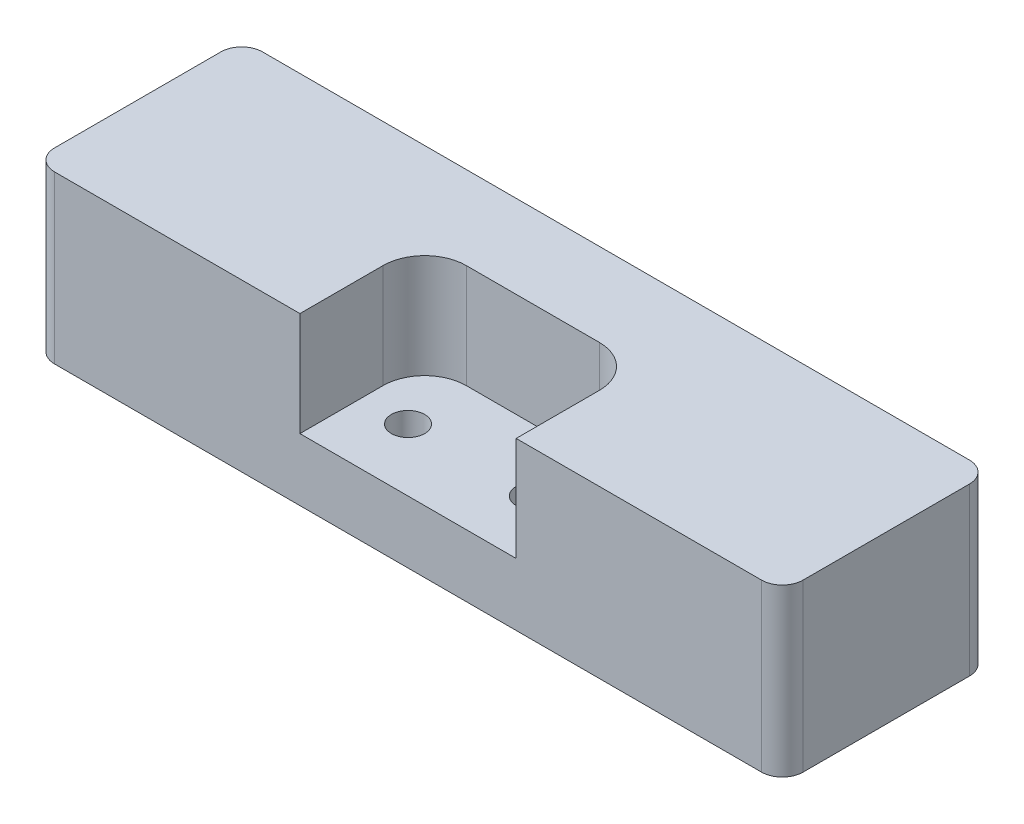
ISO-10303-21;
HEADER;
FILE_DESCRIPTION(('STEP AP214'),'2;1');
FILE_NAME('part.step','',(''),(''),'','','');
FILE_SCHEMA(('AUTOMOTIVE_DESIGN { 1 0 10303 214 1 1 1 1 }'));
ENDSEC;
DATA;
#1=APPLICATION_CONTEXT('core data for automotive mechanical design processes');
#2=APPLICATION_PROTOCOL_DEFINITION('international standard','automotive_design',2000,#1);
#3=PRODUCT_CONTEXT('',#1,'mechanical');
#4=PRODUCT('Part','Part','',(#3));
#5=PRODUCT_RELATED_PRODUCT_CATEGORY('part','',(#4));
#6=PRODUCT_DEFINITION_FORMATION('','',#4);
#7=PRODUCT_DEFINITION_CONTEXT('part definition',#1,'design');
#8=PRODUCT_DEFINITION('design','',#6,#7);
#9=PRODUCT_DEFINITION_SHAPE('','',#8);
#10=(LENGTH_UNIT() NAMED_UNIT(*) SI_UNIT(.MILLI.,.METRE.));
#11=(NAMED_UNIT(*) PLANE_ANGLE_UNIT() SI_UNIT($,.RADIAN.));
#12=(NAMED_UNIT(*) SI_UNIT($,.STERADIAN.) SOLID_ANGLE_UNIT());
#13=UNCERTAINTY_MEASURE_WITH_UNIT(LENGTH_MEASURE(1.E-05),#10,'distance_accuracy_value','');
#14=(GEOMETRIC_REPRESENTATION_CONTEXT(3) GLOBAL_UNCERTAINTY_ASSIGNED_CONTEXT((#13)) GLOBAL_UNIT_ASSIGNED_CONTEXT((#10,
#11,#12)) REPRESENTATION_CONTEXT('',''));
#15=CARTESIAN_POINT('',(0.,0.,0.));
#16=DIRECTION('',(0.,0.,1.));
#17=DIRECTION('',(1.,0.,0.));
#18=AXIS2_PLACEMENT_3D('',#15,#16,#17);
#19=CARTESIAN_POINT('',(33.,8.,0.));
#20=DIRECTION('',(-1.,0.,0.));
#21=DIRECTION('',(0.,0.,1.));
#22=AXIS2_PLACEMENT_3D('',#19,#20,#21);
#23=PLANE('',#22);
#24=DIRECTION('',(0.,0.,-1.));
#25=VECTOR('',#24,1.);
#26=CARTESIAN_POINT('',(33.,8.,0.));
#27=LINE('',#26,#25);
#28=CARTESIAN_POINT('',(33.,8.,-0.999999999999998));
#29=VERTEX_POINT('',#28);
#30=CARTESIAN_POINT('',(33.,8.,-9.));
#31=VERTEX_POINT('',#30);
#32=EDGE_CURVE('E172',#29,#31,#27,.T.);
#33=ORIENTED_EDGE('',*,*,#32,.F.);
#34=DIRECTION('',(0.,-1.,0.));
#35=VECTOR('',#34,1.);
#36=CARTESIAN_POINT('',(33.,8.,-0.999999999999998));
#37=LINE('',#36,#35);
#38=CARTESIAN_POINT('',(33.,0.,-0.999999999999998));
#39=VERTEX_POINT('',#38);
#40=EDGE_CURVE('E197',#29,#39,#37,.T.);
#41=ORIENTED_EDGE('',*,*,#40,.T.);
#42=DIRECTION('',(0.,0.,-1.));
#43=VECTOR('',#42,1.);
#44=CARTESIAN_POINT('',(33.,0.,0.));
#45=LINE('',#44,#43);
#46=CARTESIAN_POINT('',(33.,0.,-9.));
#47=VERTEX_POINT('',#46);
#48=EDGE_CURVE('E170',#39,#47,#45,.T.);
#49=ORIENTED_EDGE('',*,*,#48,.T.);
#50=DIRECTION('',(0.,-1.,0.));
#51=VECTOR('',#50,1.);
#52=CARTESIAN_POINT('',(33.,8.,-9.));
#53=LINE('',#52,#51);
#54=EDGE_CURVE('E185',#47,#31,#53,.F.);
#55=ORIENTED_EDGE('',*,*,#54,.T.);
#56=EDGE_LOOP('',(#33,#41,#49,#55));
#57=FACE_BOUND('',#56,.T.);
#58=ADVANCED_FACE('F37',(#57),#23,.F.);
#59=CARTESIAN_POINT('',(-3.,8.,-10.));
#60=DIRECTION('',(0.,0.,1.));
#61=DIRECTION('',(1.,0.,0.));
#62=AXIS2_PLACEMENT_3D('',#59,#60,#61);
#63=PLANE('',#62);
#64=DIRECTION('',(-1.,0.,0.));
#65=VECTOR('',#64,1.);
#66=CARTESIAN_POINT('',(-3.,8.,-10.));
#67=LINE('',#66,#65);
#68=CARTESIAN_POINT('',(32.,8.,-10.));
#69=VERTEX_POINT('',#68);
#70=CARTESIAN_POINT('',(-2.,8.,-10.));
#71=VERTEX_POINT('',#70);
#72=EDGE_CURVE('E175',#69,#71,#67,.T.);
#73=ORIENTED_EDGE('',*,*,#72,.F.);
#74=DIRECTION('',(0.,-1.,0.));
#75=VECTOR('',#74,1.);
#76=CARTESIAN_POINT('',(32.,8.,-10.));
#77=LINE('',#76,#75);
#78=CARTESIAN_POINT('',(32.,0.,-10.));
#79=VERTEX_POINT('',#78);
#80=EDGE_CURVE('E224',#69,#79,#77,.T.);
#81=ORIENTED_EDGE('',*,*,#80,.T.);
#82=DIRECTION('',(-1.,0.,0.));
#83=VECTOR('',#82,1.);
#84=CARTESIAN_POINT('',(-3.,0.,-10.));
#85=LINE('',#84,#83);
#86=CARTESIAN_POINT('',(-2.,0.,-10.));
#87=VERTEX_POINT('',#86);
#88=EDGE_CURVE('E188',#79,#87,#85,.T.);
#89=ORIENTED_EDGE('',*,*,#88,.T.);
#90=DIRECTION('',(0.,-1.,0.));
#91=VECTOR('',#90,1.);
#92=CARTESIAN_POINT('',(-2.,8.,-10.));
#93=LINE('',#92,#91);
#94=EDGE_CURVE('E222',#87,#71,#93,.F.);
#95=ORIENTED_EDGE('',*,*,#94,.T.);
#96=EDGE_LOOP('',(#73,#81,#89,#95));
#97=FACE_BOUND('',#96,.T.);
#98=ADVANCED_FACE('F290',(#97),#63,.F.);
#99=CARTESIAN_POINT('',(-3.,8.,0.));
#100=DIRECTION('',(1.,0.,0.));
#101=DIRECTION('',(0.,0.,-1.));
#102=AXIS2_PLACEMENT_3D('',#99,#100,#101);
#103=PLANE('',#102);
#104=DIRECTION('',(0.,0.,1.));
#105=VECTOR('',#104,1.);
#106=CARTESIAN_POINT('',(-3.,8.,0.));
#107=LINE('',#106,#105);
#108=CARTESIAN_POINT('',(-3.,8.,-9.));
#109=VERTEX_POINT('',#108);
#110=CARTESIAN_POINT('',(-3.,8.,-0.999999999999997));
#111=VERTEX_POINT('',#110);
#112=EDGE_CURVE('E179',#109,#111,#107,.T.);
#113=ORIENTED_EDGE('',*,*,#112,.F.);
#114=DIRECTION('',(0.,-1.,0.));
#115=VECTOR('',#114,1.);
#116=CARTESIAN_POINT('',(-3.,8.,-9.));
#117=LINE('',#116,#115);
#118=CARTESIAN_POINT('',(-3.,0.,-9.));
#119=VERTEX_POINT('',#118);
#120=EDGE_CURVE('E229',#109,#119,#117,.T.);
#121=ORIENTED_EDGE('',*,*,#120,.T.);
#122=DIRECTION('',(0.,0.,1.));
#123=VECTOR('',#122,1.);
#124=CARTESIAN_POINT('',(-3.,0.,0.));
#125=LINE('',#124,#123);
#126=CARTESIAN_POINT('',(-3.,0.,-0.999999999999997));
#127=VERTEX_POINT('',#126);
#128=EDGE_CURVE('E191',#119,#127,#125,.T.);
#129=ORIENTED_EDGE('',*,*,#128,.T.);
#130=DIRECTION('',(0.,-1.,0.));
#131=VECTOR('',#130,1.);
#132=CARTESIAN_POINT('',(-3.,8.,-0.999999999999997));
#133=LINE('',#132,#131);
#134=EDGE_CURVE('E227',#127,#111,#133,.F.);
#135=ORIENTED_EDGE('',*,*,#134,.T.);
#136=EDGE_LOOP('',(#113,#121,#129,#135));
#137=FACE_BOUND('',#136,.T.);
#138=ADVANCED_FACE('F296',(#137),#103,.F.);
#139=CARTESIAN_POINT('',(33.,8.,0.));
#140=DIRECTION('',(0.,0.,-1.));
#141=DIRECTION('',(-1.,0.,0.));
#142=AXIS2_PLACEMENT_3D('',#139,#140,#141);
#143=PLANE('',#142);
#144=DIRECTION('',(1.,0.,0.));
#145=VECTOR('',#144,1.);
#146=CARTESIAN_POINT('',(33.,8.,0.));
#147=LINE('',#146,#145);
#148=CARTESIAN_POINT('',(20.2,8.,0.));
#149=VERTEX_POINT('',#148);
#150=CARTESIAN_POINT('',(32.,8.,0.));
#151=VERTEX_POINT('',#150);
#152=EDGE_CURVE('E182',#149,#151,#147,.T.);
#153=ORIENTED_EDGE('',*,*,#152,.F.);
#154=DIRECTION('',(0.,1.,0.));
#155=VECTOR('',#154,1.);
#156=CARTESIAN_POINT('',(20.2,3.,0.));
#157=LINE('',#156,#155);
#158=CARTESIAN_POINT('',(20.2,3.,0.));
#159=VERTEX_POINT('',#158);
#160=EDGE_CURVE('E154',#159,#149,#157,.T.);
#161=ORIENTED_EDGE('',*,*,#160,.F.);
#162=DIRECTION('',(1.,0.,0.));
#163=VECTOR('',#162,1.);
#164=CARTESIAN_POINT('',(9.8,3.,0.));
#165=LINE('',#164,#163);
#166=CARTESIAN_POINT('',(9.8,3.,0.));
#167=VERTEX_POINT('',#166);
#168=EDGE_CURVE('E141',#167,#159,#165,.T.);
#169=ORIENTED_EDGE('',*,*,#168,.F.);
#170=DIRECTION('',(0.,1.,0.));
#171=VECTOR('',#170,1.);
#172=CARTESIAN_POINT('',(9.8,3.,0.));
#173=LINE('',#172,#171);
#174=CARTESIAN_POINT('',(9.8,8.,0.));
#175=VERTEX_POINT('',#174);
#176=EDGE_CURVE('E147',#167,#175,#173,.T.);
#177=ORIENTED_EDGE('',*,*,#176,.T.);
#178=CARTESIAN_POINT('',(-1.99999999999999,8.,0.));
#179=VERTEX_POINT('',#178);
#180=EDGE_CURVE('E183',#179,#175,#147,.T.);
#181=ORIENTED_EDGE('',*,*,#180,.F.);
#182=DIRECTION('',(0.,-1.,0.));
#183=VECTOR('',#182,1.);
#184=CARTESIAN_POINT('',(-1.99999999999999,8.,0.));
#185=LINE('',#184,#183);
#186=CARTESIAN_POINT('',(-1.99999999999999,0.,0.));
#187=VERTEX_POINT('',#186);
#188=EDGE_CURVE('E208',#179,#187,#185,.T.);
#189=ORIENTED_EDGE('',*,*,#188,.T.);
#190=DIRECTION('',(1.,0.,0.));
#191=VECTOR('',#190,1.);
#192=CARTESIAN_POINT('',(33.,0.,0.));
#193=LINE('',#192,#191);
#194=CARTESIAN_POINT('',(32.,0.,0.));
#195=VERTEX_POINT('',#194);
#196=EDGE_CURVE('E176',#187,#195,#193,.T.);
#197=ORIENTED_EDGE('',*,*,#196,.T.);
#198=DIRECTION('',(0.,-1.,0.));
#199=VECTOR('',#198,1.);
#200=CARTESIAN_POINT('',(32.,8.,0.));
#201=LINE('',#200,#199);
#202=EDGE_CURVE('E211',#195,#151,#201,.F.);
#203=ORIENTED_EDGE('',*,*,#202,.T.);
#204=EDGE_LOOP('',(#153,#161,#169,#177,#181,#189,#197,#203));
#205=FACE_BOUND('',#204,.T.);
#206=ADVANCED_FACE('F157',(#205),#143,.F.);
#207=CARTESIAN_POINT('',(0.,8.,0.));
#208=DIRECTION('',(0.,-1.,0.));
#209=DIRECTION('',(0.,0.,-1.));
#210=AXIS2_PLACEMENT_3D('',#207,#208,#209);
#211=PLANE('',#210);
#212=DIRECTION('',(-1.,0.,0.));
#213=VECTOR('',#212,1.);
#214=CARTESIAN_POINT('',(9.8,8.,-6.));
#215=LINE('',#214,#213);
#216=CARTESIAN_POINT('',(18.2,8.,-6.));
#217=VERTEX_POINT('',#216);
#218=CARTESIAN_POINT('',(11.8,8.,-6.));
#219=VERTEX_POINT('',#218);
#220=EDGE_CURVE('E164',#217,#219,#215,.T.);
#221=ORIENTED_EDGE('',*,*,#220,.F.);
#222=CARTESIAN_POINT('',(18.2,8.,-4.));
#223=DIRECTION('',(0.,-1.,0.));
#224=DIRECTION('',(0.,0.,-1.));
#225=AXIS2_PLACEMENT_3D('',#222,#223,#224);
#226=CIRCLE('',#225,2.);
#227=CARTESIAN_POINT('',(20.2,8.,-4.));
#228=VERTEX_POINT('',#227);
#229=EDGE_CURVE('E45',#217,#228,#226,.T.);
#230=ORIENTED_EDGE('',*,*,#229,.T.);
#231=DIRECTION('',(0.,0.,-1.));
#232=VECTOR('',#231,1.);
#233=CARTESIAN_POINT('',(20.2,8.,0.));
#234=LINE('',#233,#232);
#235=EDGE_CURVE('E161',#149,#228,#234,.T.);
#236=ORIENTED_EDGE('',*,*,#235,.F.);
#237=ORIENTED_EDGE('',*,*,#152,.T.);
#238=CARTESIAN_POINT('',(32.,8.,-0.999999999999998));
#239=DIRECTION('',(0.,-1.,0.));
#240=DIRECTION('',(0.,0.,-1.));
#241=AXIS2_PLACEMENT_3D('',#238,#239,#240);
#242=CIRCLE('',#241,1.);
#243=EDGE_CURVE('E220',#151,#29,#242,.F.);
#244=ORIENTED_EDGE('',*,*,#243,.T.);
#245=ORIENTED_EDGE('',*,*,#32,.T.);
#246=CARTESIAN_POINT('',(32.,8.,-9.));
#247=DIRECTION('',(0.,-1.,0.));
#248=DIRECTION('',(0.,0.,-1.));
#249=AXIS2_PLACEMENT_3D('',#246,#247,#248);
#250=CIRCLE('',#249,1.);
#251=EDGE_CURVE('E218',#31,#69,#250,.F.);
#252=ORIENTED_EDGE('',*,*,#251,.T.);
#253=ORIENTED_EDGE('',*,*,#72,.T.);
#254=CARTESIAN_POINT('',(-2.,8.,-9.));
#255=DIRECTION('',(0.,-1.,0.));
#256=DIRECTION('',(0.,0.,-1.));
#257=AXIS2_PLACEMENT_3D('',#254,#255,#256);
#258=CIRCLE('',#257,1.);
#259=EDGE_CURVE('E216',#71,#109,#258,.F.);
#260=ORIENTED_EDGE('',*,*,#259,.T.);
#261=ORIENTED_EDGE('',*,*,#112,.T.);
#262=CARTESIAN_POINT('',(-1.99999999999999,8.,-0.999999999999998));
#263=DIRECTION('',(0.,-1.,0.));
#264=DIRECTION('',(0.,0.,-1.));
#265=AXIS2_PLACEMENT_3D('',#262,#263,#264);
#266=CIRCLE('',#265,1.);
#267=EDGE_CURVE('E214',#111,#179,#266,.F.);
#268=ORIENTED_EDGE('',*,*,#267,.T.);
#269=ORIENTED_EDGE('',*,*,#180,.T.);
#270=DIRECTION('',(0.,0.,1.));
#271=VECTOR('',#270,1.);
#272=CARTESIAN_POINT('',(9.8,8.,-6.));
#273=LINE('',#272,#271);
#274=CARTESIAN_POINT('',(9.8,8.,-4.));
#275=VERTEX_POINT('',#274);
#276=EDGE_CURVE('E150',#275,#175,#273,.T.);
#277=ORIENTED_EDGE('',*,*,#276,.F.);
#278=CARTESIAN_POINT('',(11.8,8.,-4.));
#279=DIRECTION('',(0.,-1.,0.));
#280=DIRECTION('',(0.,0.,-1.));
#281=AXIS2_PLACEMENT_3D('',#278,#279,#280);
#282=CIRCLE('',#281,2.);
#283=EDGE_CURVE('E11',#275,#219,#282,.T.);
#284=ORIENTED_EDGE('',*,*,#283,.T.);
#285=EDGE_LOOP('',(#221,#230,#236,#237,#244,#245,#252,#253,#260,#261,#268,#269,#277,#284));
#286=FACE_BOUND('',#285,.T.);
#287=ADVANCED_FACE('F246',(#286),#211,.F.);
#288=CARTESIAN_POINT('',(0.,0.,0.));
#289=DIRECTION('',(0.,-1.,0.));
#290=DIRECTION('',(0.,0.,-1.));
#291=AXIS2_PLACEMENT_3D('',#288,#289,#290);
#292=PLANE('',#291);
#293=CARTESIAN_POINT('',(12.,0.,-3.));
#294=DIRECTION('',(0.,1.,0.));
#295=DIRECTION('',(0.,0.,1.));
#296=AXIS2_PLACEMENT_3D('',#293,#294,#295);
#297=CIRCLE('',#296,0.799999999999999);
#298=CARTESIAN_POINT('',(12.,0.,-2.2));
#299=VERTEX_POINT('',#298);
#300=EDGE_CURVE('E264',#299,#299,#297,.T.);
#301=ORIENTED_EDGE('',*,*,#300,.T.);
#302=EDGE_LOOP('',(#301));
#303=FACE_BOUND('',#302,.T.);
#304=CARTESIAN_POINT('',(18.,0.,-3.));
#305=DIRECTION('',(0.,1.,0.));
#306=DIRECTION('',(0.,0.,1.));
#307=AXIS2_PLACEMENT_3D('',#304,#305,#306);
#308=CIRCLE('',#307,0.799999999999999);
#309=CARTESIAN_POINT('',(18.,0.,-2.2));
#310=VERTEX_POINT('',#309);
#311=EDGE_CURVE('E165',#310,#310,#308,.T.);
#312=ORIENTED_EDGE('',*,*,#311,.T.);
#313=EDGE_LOOP('',(#312));
#314=FACE_BOUND('',#313,.T.);
#315=ORIENTED_EDGE('',*,*,#48,.F.);
#316=CARTESIAN_POINT('',(32.,0.,-0.999999999999998));
#317=DIRECTION('',(0.,-1.,0.));
#318=DIRECTION('',(0.,0.,-1.));
#319=AXIS2_PLACEMENT_3D('',#316,#317,#318);
#320=CIRCLE('',#319,1.);
#321=EDGE_CURVE('E206',#39,#195,#320,.T.);
#322=ORIENTED_EDGE('',*,*,#321,.T.);
#323=ORIENTED_EDGE('',*,*,#196,.F.);
#324=CARTESIAN_POINT('',(-1.99999999999999,0.,-0.999999999999998));
#325=DIRECTION('',(0.,-1.,0.));
#326=DIRECTION('',(0.,0.,-1.));
#327=AXIS2_PLACEMENT_3D('',#324,#325,#326);
#328=CIRCLE('',#327,1.);
#329=EDGE_CURVE('E200',#187,#127,#328,.T.);
#330=ORIENTED_EDGE('',*,*,#329,.T.);
#331=ORIENTED_EDGE('',*,*,#128,.F.);
#332=CARTESIAN_POINT('',(-2.,0.,-9.));
#333=DIRECTION('',(0.,-1.,0.));
#334=DIRECTION('',(0.,0.,-1.));
#335=AXIS2_PLACEMENT_3D('',#332,#333,#334);
#336=CIRCLE('',#335,1.);
#337=EDGE_CURVE('E202',#119,#87,#336,.T.);
#338=ORIENTED_EDGE('',*,*,#337,.T.);
#339=ORIENTED_EDGE('',*,*,#88,.F.);
#340=CARTESIAN_POINT('',(32.,0.,-9.));
#341=DIRECTION('',(0.,-1.,0.));
#342=DIRECTION('',(0.,0.,-1.));
#343=AXIS2_PLACEMENT_3D('',#340,#341,#342);
#344=CIRCLE('',#343,1.);
#345=EDGE_CURVE('E204',#79,#47,#344,.T.);
#346=ORIENTED_EDGE('',*,*,#345,.T.);
#347=EDGE_LOOP('',(#315,#322,#323,#330,#331,#338,#339,#346));
#348=FACE_BOUND('',#347,.T.);
#349=ADVANCED_FACE('F306',(#303,#314,#348),#292,.T.);
#350=CARTESIAN_POINT('',(32.,8.,-0.999999999999998));
#351=DIRECTION('',(0.,-1.,0.));
#352=DIRECTION('',(0.,0.,-1.));
#353=AXIS2_PLACEMENT_3D('',#350,#351,#352);
#354=CYLINDRICAL_SURFACE('',#353,1.);
#355=ORIENTED_EDGE('',*,*,#243,.F.);
#356=ORIENTED_EDGE('',*,*,#202,.F.);
#357=ORIENTED_EDGE('',*,*,#321,.F.);
#358=ORIENTED_EDGE('',*,*,#40,.F.);
#359=EDGE_LOOP('',(#355,#356,#357,#358));
#360=FACE_BOUND('',#359,.T.);
#361=ADVANCED_FACE('F302',(#360),#354,.T.);
#362=CARTESIAN_POINT('',(32.,8.,-9.));
#363=DIRECTION('',(0.,-1.,0.));
#364=DIRECTION('',(0.,0.,-1.));
#365=AXIS2_PLACEMENT_3D('',#362,#363,#364);
#366=CYLINDRICAL_SURFACE('',#365,1.);
#367=ORIENTED_EDGE('',*,*,#251,.F.);
#368=ORIENTED_EDGE('',*,*,#54,.F.);
#369=ORIENTED_EDGE('',*,*,#345,.F.);
#370=ORIENTED_EDGE('',*,*,#80,.F.);
#371=EDGE_LOOP('',(#367,#368,#369,#370));
#372=FACE_BOUND('',#371,.T.);
#373=ADVANCED_FACE('F305',(#372),#366,.T.);
#374=CARTESIAN_POINT('',(-2.,8.,-9.));
#375=DIRECTION('',(0.,-1.,0.));
#376=DIRECTION('',(0.,0.,-1.));
#377=AXIS2_PLACEMENT_3D('',#374,#375,#376);
#378=CYLINDRICAL_SURFACE('',#377,1.);
#379=ORIENTED_EDGE('',*,*,#259,.F.);
#380=ORIENTED_EDGE('',*,*,#94,.F.);
#381=ORIENTED_EDGE('',*,*,#337,.F.);
#382=ORIENTED_EDGE('',*,*,#120,.F.);
#383=EDGE_LOOP('',(#379,#380,#381,#382));
#384=FACE_BOUND('',#383,.T.);
#385=ADVANCED_FACE('F310',(#384),#378,.T.);
#386=CARTESIAN_POINT('',(-1.99999999999999,8.,-0.999999999999998));
#387=DIRECTION('',(0.,-1.,0.));
#388=DIRECTION('',(0.,0.,-1.));
#389=AXIS2_PLACEMENT_3D('',#386,#387,#388);
#390=CYLINDRICAL_SURFACE('',#389,1.);
#391=ORIENTED_EDGE('',*,*,#267,.F.);
#392=ORIENTED_EDGE('',*,*,#134,.F.);
#393=ORIENTED_EDGE('',*,*,#329,.F.);
#394=ORIENTED_EDGE('',*,*,#188,.F.);
#395=EDGE_LOOP('',(#391,#392,#393,#394));
#396=FACE_BOUND('',#395,.T.);
#397=ADVANCED_FACE('F314',(#396),#390,.T.);
#398=CARTESIAN_POINT('',(20.2,3.,0.));
#399=DIRECTION('',(1.,0.,0.));
#400=DIRECTION('',(0.,0.,-1.));
#401=AXIS2_PLACEMENT_3D('',#398,#399,#400);
#402=PLANE('',#401);
#403=ORIENTED_EDGE('',*,*,#235,.T.);
#404=DIRECTION('',(0.,1.,0.));
#405=VECTOR('',#404,1.);
#406=CARTESIAN_POINT('',(20.2,3.,-4.));
#407=LINE('',#406,#405);
#408=CARTESIAN_POINT('',(20.2,3.,-4.));
#409=VERTEX_POINT('',#408);
#410=EDGE_CURVE('E237',#228,#409,#407,.F.);
#411=ORIENTED_EDGE('',*,*,#410,.T.);
#412=DIRECTION('',(0.,0.,-1.));
#413=VECTOR('',#412,1.);
#414=CARTESIAN_POINT('',(20.2,3.,0.));
#415=LINE('',#414,#413);
#416=EDGE_CURVE('E169',#159,#409,#415,.T.);
#417=ORIENTED_EDGE('',*,*,#416,.F.);
#418=ORIENTED_EDGE('',*,*,#160,.T.);
#419=EDGE_LOOP('',(#403,#411,#417,#418));
#420=FACE_BOUND('',#419,.T.);
#421=ADVANCED_FACE('F251',(#420),#402,.F.);
#422=CARTESIAN_POINT('',(9.8,3.,-6.));
#423=DIRECTION('',(-1.,0.,0.));
#424=DIRECTION('',(0.,0.,1.));
#425=AXIS2_PLACEMENT_3D('',#422,#423,#424);
#426=PLANE('',#425);
#427=DIRECTION('',(0.,0.,1.));
#428=VECTOR('',#427,1.);
#429=CARTESIAN_POINT('',(9.8,3.,-6.));
#430=LINE('',#429,#428);
#431=CARTESIAN_POINT('',(9.8,3.,-4.));
#432=VERTEX_POINT('',#431);
#433=EDGE_CURVE('E136',#432,#167,#430,.T.);
#434=ORIENTED_EDGE('',*,*,#433,.F.);
#435=DIRECTION('',(0.,1.,0.));
#436=VECTOR('',#435,1.);
#437=CARTESIAN_POINT('',(9.8,8.,-4.));
#438=LINE('',#437,#436);
#439=EDGE_CURVE('E242',#432,#275,#438,.T.);
#440=ORIENTED_EDGE('',*,*,#439,.T.);
#441=ORIENTED_EDGE('',*,*,#276,.T.);
#442=ORIENTED_EDGE('',*,*,#176,.F.);
#443=EDGE_LOOP('',(#434,#440,#441,#442));
#444=FACE_BOUND('',#443,.T.);
#445=ADVANCED_FACE('F148',(#444),#426,.F.);
#446=CARTESIAN_POINT('',(9.8,3.,-6.));
#447=DIRECTION('',(0.,0.,-1.));
#448=DIRECTION('',(-1.,0.,0.));
#449=AXIS2_PLACEMENT_3D('',#446,#447,#448);
#450=PLANE('',#449);
#451=DIRECTION('',(-1.,0.,0.));
#452=VECTOR('',#451,1.);
#453=CARTESIAN_POINT('',(9.8,3.,-6.));
#454=LINE('',#453,#452);
#455=CARTESIAN_POINT('',(18.2,3.,-6.));
#456=VERTEX_POINT('',#455);
#457=CARTESIAN_POINT('',(11.8,3.,-6.));
#458=VERTEX_POINT('',#457);
#459=EDGE_CURVE('E144',#456,#458,#454,.T.);
#460=ORIENTED_EDGE('',*,*,#459,.F.);
#461=DIRECTION('',(0.,1.,0.));
#462=VECTOR('',#461,1.);
#463=CARTESIAN_POINT('',(18.2,8.,-6.));
#464=LINE('',#463,#462);
#465=EDGE_CURVE('E234',#456,#217,#464,.T.);
#466=ORIENTED_EDGE('',*,*,#465,.T.);
#467=ORIENTED_EDGE('',*,*,#220,.T.);
#468=DIRECTION('',(0.,1.,0.));
#469=VECTOR('',#468,1.);
#470=CARTESIAN_POINT('',(11.8,3.,-6.));
#471=LINE('',#470,#469);
#472=EDGE_CURVE('E232',#219,#458,#471,.F.);
#473=ORIENTED_EDGE('',*,*,#472,.T.);
#474=EDGE_LOOP('',(#460,#466,#467,#473));
#475=FACE_BOUND('',#474,.T.);
#476=ADVANCED_FACE('F256',(#475),#450,.F.);
#477=CARTESIAN_POINT('',(0.,3.,0.));
#478=DIRECTION('',(0.,-1.,0.));
#479=DIRECTION('',(0.,0.,-1.));
#480=AXIS2_PLACEMENT_3D('',#477,#478,#479);
#481=PLANE('',#480);
#482=CARTESIAN_POINT('',(12.,3.,-3.));
#483=DIRECTION('',(0.,1.,0.));
#484=DIRECTION('',(0.,0.,1.));
#485=AXIS2_PLACEMENT_3D('',#482,#483,#484);
#486=CIRCLE('',#485,0.8);
#487=CARTESIAN_POINT('',(12.,3.,-2.2));
#488=VERTEX_POINT('',#487);
#489=EDGE_CURVE('E267',#488,#488,#486,.T.);
#490=ORIENTED_EDGE('',*,*,#489,.F.);
#491=EDGE_LOOP('',(#490));
#492=FACE_BOUND('',#491,.T.);
#493=CARTESIAN_POINT('',(18.,3.,-3.));
#494=DIRECTION('',(0.,1.,0.));
#495=DIRECTION('',(0.,0.,1.));
#496=AXIS2_PLACEMENT_3D('',#493,#494,#495);
#497=CIRCLE('',#496,0.799999999999999);
#498=CARTESIAN_POINT('',(18.,3.,-2.2));
#499=VERTEX_POINT('',#498);
#500=EDGE_CURVE('E261',#499,#499,#497,.T.);
#501=ORIENTED_EDGE('',*,*,#500,.F.);
#502=EDGE_LOOP('',(#501));
#503=FACE_BOUND('',#502,.T.);
#504=ORIENTED_EDGE('',*,*,#416,.T.);
#505=CARTESIAN_POINT('',(18.2,3.,-4.));
#506=DIRECTION('',(0.,-1.,0.));
#507=DIRECTION('',(0.,0.,-1.));
#508=AXIS2_PLACEMENT_3D('',#505,#506,#507);
#509=CIRCLE('',#508,2.);
#510=EDGE_CURVE('E240',#409,#456,#509,.F.);
#511=ORIENTED_EDGE('',*,*,#510,.T.);
#512=ORIENTED_EDGE('',*,*,#459,.T.);
#513=CARTESIAN_POINT('',(11.8,3.,-4.));
#514=DIRECTION('',(0.,-1.,0.));
#515=DIRECTION('',(0.,0.,-1.));
#516=AXIS2_PLACEMENT_3D('',#513,#514,#515);
#517=CIRCLE('',#516,2.);
#518=EDGE_CURVE('E58',#458,#432,#517,.F.);
#519=ORIENTED_EDGE('',*,*,#518,.T.);
#520=ORIENTED_EDGE('',*,*,#433,.T.);
#521=ORIENTED_EDGE('',*,*,#168,.T.);
#522=EDGE_LOOP('',(#504,#511,#512,#519,#520,#521));
#523=FACE_BOUND('',#522,.T.);
#524=ADVANCED_FACE('F139',(#492,#503,#523),#481,.F.);
#525=CARTESIAN_POINT('',(18.2,3.,-4.));
#526=DIRECTION('',(0.,-1.,0.));
#527=DIRECTION('',(0.,0.,-1.));
#528=AXIS2_PLACEMENT_3D('',#525,#526,#527);
#529=CYLINDRICAL_SURFACE('',#528,2.);
#530=ORIENTED_EDGE('',*,*,#510,.F.);
#531=ORIENTED_EDGE('',*,*,#410,.F.);
#532=ORIENTED_EDGE('',*,*,#229,.F.);
#533=ORIENTED_EDGE('',*,*,#465,.F.);
#534=EDGE_LOOP('',(#530,#531,#532,#533));
#535=FACE_BOUND('',#534,.T.);
#536=ADVANCED_FACE('F253',(#535),#529,.F.);
#537=CARTESIAN_POINT('',(11.8,3.,-4.));
#538=DIRECTION('',(0.,-1.,0.));
#539=DIRECTION('',(0.,0.,-1.));
#540=AXIS2_PLACEMENT_3D('',#537,#538,#539);
#541=CYLINDRICAL_SURFACE('',#540,2.);
#542=ORIENTED_EDGE('',*,*,#518,.F.);
#543=ORIENTED_EDGE('',*,*,#472,.F.);
#544=ORIENTED_EDGE('',*,*,#283,.F.);
#545=ORIENTED_EDGE('',*,*,#439,.F.);
#546=EDGE_LOOP('',(#542,#543,#544,#545));
#547=FACE_BOUND('',#546,.T.);
#548=ADVANCED_FACE('F39',(#547),#541,.F.);
#549=CARTESIAN_POINT('',(18.,3.,-3.));
#550=DIRECTION('',(0.,1.,0.));
#551=DIRECTION('',(0.,0.,1.));
#552=AXIS2_PLACEMENT_3D('',#549,#550,#551);
#553=CYLINDRICAL_SURFACE('',#552,0.799999999999999);
#554=ORIENTED_EDGE('',*,*,#311,.F.);
#555=EDGE_LOOP('',(#554));
#556=FACE_BOUND('',#555,.T.);
#557=ORIENTED_EDGE('',*,*,#500,.T.);
#558=EDGE_LOOP('',(#557));
#559=FACE_BOUND('',#558,.T.);
#560=ADVANCED_FACE('F278',(#556,#559),#553,.F.);
#561=CARTESIAN_POINT('',(12.,3.,-3.));
#562=DIRECTION('',(0.,1.,0.));
#563=DIRECTION('',(0.,0.,1.));
#564=AXIS2_PLACEMENT_3D('',#561,#562,#563);
#565=CYLINDRICAL_SURFACE('',#564,0.799999999999999);
#566=ORIENTED_EDGE('',*,*,#300,.F.);
#567=EDGE_LOOP('',(#566));
#568=FACE_BOUND('',#567,.T.);
#569=ORIENTED_EDGE('',*,*,#489,.T.);
#570=EDGE_LOOP('',(#569));
#571=FACE_BOUND('',#570,.T.);
#572=ADVANCED_FACE('F271',(#568,#571),#565,.F.);
#573=CLOSED_SHELL('',(#58,#98,#138,#206,#287,#349,#361,#373,#385,#397,#421,#445,#476,#524,#536,
#548,#560,#572));
#574=MANIFOLD_SOLID_BREP('B2',#573);
#575=ADVANCED_BREP_SHAPE_REPRESENTATION('',(#18,#574),#14);
#576=SHAPE_DEFINITION_REPRESENTATION(#9,#575);
ENDSEC;
END-ISO-10303-21;
